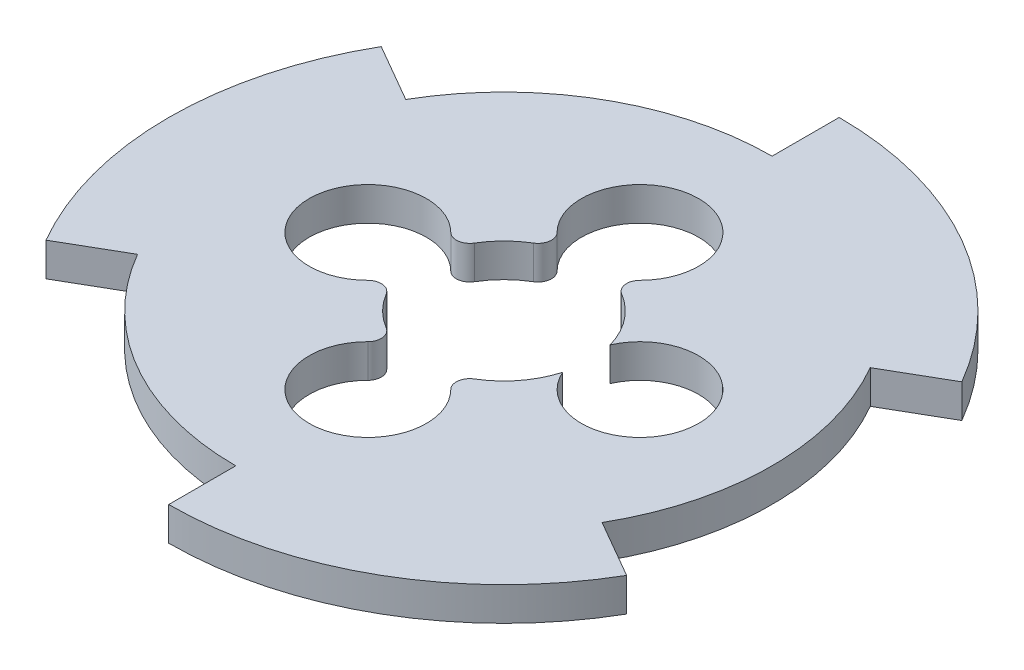
ISO-10303-21;
HEADER;
FILE_DESCRIPTION(('STEP AP214'),'2;1');
FILE_NAME('part.step','',(''),(''),'','','');
FILE_SCHEMA(('AUTOMOTIVE_DESIGN { 1 0 10303 214 1 1 1 1 }'));
ENDSEC;
DATA;
#1=APPLICATION_CONTEXT('core data for automotive mechanical design processes');
#2=APPLICATION_PROTOCOL_DEFINITION('international standard','automotive_design',2000,#1);
#3=PRODUCT_CONTEXT('',#1,'mechanical');
#4=PRODUCT('Part','Part','',(#3));
#5=PRODUCT_RELATED_PRODUCT_CATEGORY('part','',(#4));
#6=PRODUCT_DEFINITION_FORMATION('','',#4);
#7=PRODUCT_DEFINITION_CONTEXT('part definition',#1,'design');
#8=PRODUCT_DEFINITION('design','',#6,#7);
#9=PRODUCT_DEFINITION_SHAPE('','',#8);
#10=(LENGTH_UNIT() NAMED_UNIT(*) SI_UNIT(.MILLI.,.METRE.));
#11=(NAMED_UNIT(*) PLANE_ANGLE_UNIT() SI_UNIT($,.RADIAN.));
#12=(NAMED_UNIT(*) SI_UNIT($,.STERADIAN.) SOLID_ANGLE_UNIT());
#13=UNCERTAINTY_MEASURE_WITH_UNIT(LENGTH_MEASURE(1.E-05),#10,'distance_accuracy_value','');
#14=(GEOMETRIC_REPRESENTATION_CONTEXT(3) GLOBAL_UNCERTAINTY_ASSIGNED_CONTEXT((#13)) GLOBAL_UNIT_ASSIGNED_CONTEXT((#10,
#11,#12)) REPRESENTATION_CONTEXT('',''));
#15=CARTESIAN_POINT('',(0.,0.,0.));
#16=DIRECTION('',(0.,0.,1.));
#17=DIRECTION('',(1.,0.,0.));
#18=AXIS2_PLACEMENT_3D('',#15,#16,#17);
#19=CARTESIAN_POINT('',(0.,6.35,0.));
#20=DIRECTION('',(0.,1.,0.));
#21=DIRECTION('',(0.,0.,1.));
#22=AXIS2_PLACEMENT_3D('',#19,#20,#21);
#23=PLANE('',#22);
#24=CARTESIAN_POINT('',(0.,6.35,0.));
#25=DIRECTION('',(0.,1.,0.));
#26=DIRECTION('',(0.,0.,1.));
#27=AXIS2_PLACEMENT_3D('',#24,#25,#26);
#28=CIRCLE('',#27,50.8);
#29=CARTESIAN_POINT('',(43.9940905122495,6.35,25.4000000000001));
#30=VERTEX_POINT('',#29);
#31=CARTESIAN_POINT('',(43.9940905122495,6.35,-25.3999999999999));
#32=VERTEX_POINT('',#31);
#33=EDGE_CURVE('E271',#30,#32,#28,.T.);
#34=ORIENTED_EDGE('',*,*,#33,.T.);
#35=DIRECTION('',(0.86602540378444,0.,-0.499999999999998));
#36=VECTOR('',#35,1.);
#37=CARTESIAN_POINT('',(43.9940905122495,6.35,-25.3999999999999));
#38=LINE('',#37,#36);
#39=CARTESIAN_POINT('',(54.9926131403087,6.35,-31.749999999998));
#40=VERTEX_POINT('',#39);
#41=EDGE_CURVE('E274',#32,#40,#38,.T.);
#42=ORIENTED_EDGE('',*,*,#41,.T.);
#43=CARTESIAN_POINT('',(0.,6.35,0.));
#44=DIRECTION('',(0.,1.,0.));
#45=DIRECTION('',(0.,0.,1.));
#46=AXIS2_PLACEMENT_3D('',#43,#44,#45);
#47=CIRCLE('',#46,63.4999999999963);
#48=CARTESIAN_POINT('',(0.,6.35,-63.4999999999963));
#49=VERTEX_POINT('',#48);
#50=EDGE_CURVE('E277',#40,#49,#47,.T.);
#51=ORIENTED_EDGE('',*,*,#50,.T.);
#52=DIRECTION('',(0.,0.,1.));
#53=VECTOR('',#52,1.);
#54=CARTESIAN_POINT('',(0.,6.35,-50.8));
#55=LINE('',#54,#53);
#56=CARTESIAN_POINT('',(0.,6.35,-50.8));
#57=VERTEX_POINT('',#56);
#58=EDGE_CURVE('E279',#49,#57,#55,.T.);
#59=ORIENTED_EDGE('',*,*,#58,.T.);
#60=CARTESIAN_POINT('',(0.,6.35,0.));
#61=DIRECTION('',(0.,1.,0.));
#62=DIRECTION('',(0.,0.,1.));
#63=AXIS2_PLACEMENT_3D('',#60,#61,#62);
#64=CIRCLE('',#63,50.8);
#65=CARTESIAN_POINT('',(-43.9940905122495,6.35,-25.4000000000001));
#66=VERTEX_POINT('',#65);
#67=EDGE_CURVE('E281',#57,#66,#64,.T.);
#68=ORIENTED_EDGE('',*,*,#67,.T.);
#69=DIRECTION('',(-0.866025403784438,0.,-0.5));
#70=VECTOR('',#69,1.);
#71=CARTESIAN_POINT('',(-43.9940905122495,6.35,-25.4000000000001));
#72=LINE('',#71,#70);
#73=CARTESIAN_POINT('',(-54.9926131403086,6.35,-31.7499999999982));
#74=VERTEX_POINT('',#73);
#75=EDGE_CURVE('E283',#66,#74,#72,.T.);
#76=ORIENTED_EDGE('',*,*,#75,.T.);
#77=CARTESIAN_POINT('',(0.,6.35,0.));
#78=DIRECTION('',(0.,1.,0.));
#79=DIRECTION('',(0.,0.,1.));
#80=AXIS2_PLACEMENT_3D('',#77,#78,#79);
#81=CIRCLE('',#80,63.4999999999963);
#82=CARTESIAN_POINT('',(-54.9926131403086,6.35,31.7499999999982));
#83=VERTEX_POINT('',#82);
#84=EDGE_CURVE('E285',#74,#83,#81,.T.);
#85=ORIENTED_EDGE('',*,*,#84,.T.);
#86=DIRECTION('',(0.866025403784439,0.,-0.5));
#87=VECTOR('',#86,1.);
#88=CARTESIAN_POINT('',(-43.9940905122495,6.35,25.4000000000001));
#89=LINE('',#88,#87);
#90=CARTESIAN_POINT('',(-43.9940905122495,6.35,25.4000000000001));
#91=VERTEX_POINT('',#90);
#92=EDGE_CURVE('E287',#83,#91,#89,.T.);
#93=ORIENTED_EDGE('',*,*,#92,.T.);
#94=CARTESIAN_POINT('',(0.,6.35,0.));
#95=DIRECTION('',(0.,1.,0.));
#96=DIRECTION('',(0.,0.,1.));
#97=AXIS2_PLACEMENT_3D('',#94,#95,#96);
#98=CIRCLE('',#97,50.8000000000001);
#99=CARTESIAN_POINT('',(-1.50796394868042E-13,6.35,50.8000000000001));
#100=VERTEX_POINT('',#99);
#101=EDGE_CURVE('E289',#91,#100,#98,.T.);
#102=ORIENTED_EDGE('',*,*,#101,.T.);
#103=DIRECTION('',(0.,0.,1.));
#104=VECTOR('',#103,1.);
#105=CARTESIAN_POINT('',(-1.50796394868042E-13,6.35,50.8000000000001));
#106=LINE('',#105,#104);
#107=CARTESIAN_POINT('',(-1.12798659301909E-13,6.35,63.4999999999963));
#108=VERTEX_POINT('',#107);
#109=EDGE_CURVE('E291',#100,#108,#106,.T.);
#110=ORIENTED_EDGE('',*,*,#109,.T.);
#111=CARTESIAN_POINT('',(0.,6.35,0.));
#112=DIRECTION('',(0.,1.,0.));
#113=DIRECTION('',(0.,0.,1.));
#114=AXIS2_PLACEMENT_3D('',#111,#112,#113);
#115=CIRCLE('',#114,63.4999999999963);
#116=CARTESIAN_POINT('',(54.9926131403086,6.35,31.7499999999982));
#117=VERTEX_POINT('',#116);
#118=EDGE_CURVE('E293',#108,#117,#115,.T.);
#119=ORIENTED_EDGE('',*,*,#118,.T.);
#120=DIRECTION('',(-0.866025403784439,0.,-0.499999999999999));
#121=VECTOR('',#120,1.);
#122=CARTESIAN_POINT('',(43.9940905122495,6.35,25.4000000000001));
#123=LINE('',#122,#121);
#124=EDGE_CURVE('E295',#117,#30,#123,.T.);
#125=ORIENTED_EDGE('',*,*,#124,.T.);
#126=EDGE_LOOP('',(#34,#42,#51,#59,#68,#76,#85,#93,#102,#110,#119,#125));
#127=FACE_BOUND('',#126,.T.);
#128=CARTESIAN_POINT('',(0.,6.35,0.));
#129=DIRECTION('',(0.,1.,0.));
#130=DIRECTION('',(0.,0.,1.));
#131=AXIS2_PLACEMENT_3D('',#128,#129,#130);
#132=CIRCLE('',#131,16.256);
#133=CARTESIAN_POINT('',(-13.9479850885369,6.35,8.34932619855951));
#134=VERTEX_POINT('',#133);
#135=CARTESIAN_POINT('',(-8.34932619855964,6.35,13.9479850885368));
#136=VERTEX_POINT('',#135);
#137=EDGE_CURVE('E245',#134,#136,#132,.T.);
#138=ORIENTED_EDGE('',*,*,#137,.F.);
#139=CARTESIAN_POINT('',(-16.1273577586208,6.35,9.65390841708444));
#140=DIRECTION('',(0.,1.,0.));
#141=DIRECTION('',(0.,0.,1.));
#142=AXIS2_PLACEMENT_3D('',#139,#140,#141);
#143=CIRCLE('',#142,2.54);
#144=CARTESIAN_POINT('',(-17.9233842221332,6.35,7.85783243251054));
#145=VERTEX_POINT('',#144);
#146=EDGE_CURVE('E386',#134,#145,#143,.T.);
#147=ORIENTED_EDGE('',*,*,#146,.T.);
#148=CARTESIAN_POINT('',(-25.781,6.35,-2.70041641190144E-13));
#149=DIRECTION('',(0.,1.,0.));
#150=DIRECTION('',(0.,0.,1.));
#151=AXIS2_PLACEMENT_3D('',#148,#149,#150);
#152=CIRCLE('',#151,11.1125);
#153=CARTESIAN_POINT('',(-17.923384222133,6.35,-7.85783243251091));
#154=VERTEX_POINT('',#153);
#155=EDGE_CURVE('E242',#154,#145,#152,.T.);
#156=ORIENTED_EDGE('',*,*,#155,.F.);
#157=CARTESIAN_POINT('',(-16.1273577586206,6.35,-9.65390841708477));
#158=DIRECTION('',(0.,1.,0.));
#159=DIRECTION('',(0.,0.,1.));
#160=AXIS2_PLACEMENT_3D('',#157,#158,#159);
#161=CIRCLE('',#160,2.54);
#162=CARTESIAN_POINT('',(-13.9479850885367,6.35,-8.3493261985598));
#163=VERTEX_POINT('',#162);
#164=EDGE_CURVE('E48',#154,#163,#161,.T.);
#165=ORIENTED_EDGE('',*,*,#164,.T.);
#166=CARTESIAN_POINT('',(0.,6.35,0.));
#167=DIRECTION('',(0.,1.,0.));
#168=DIRECTION('',(0.,0.,1.));
#169=AXIS2_PLACEMENT_3D('',#166,#167,#168);
#170=CIRCLE('',#169,16.256);
#171=CARTESIAN_POINT('',(-8.34932619855966,6.35,-13.9479850885368));
#172=VERTEX_POINT('',#171);
#173=EDGE_CURVE('E236',#172,#163,#170,.T.);
#174=ORIENTED_EDGE('',*,*,#173,.F.);
#175=CARTESIAN_POINT('',(-9.65390841708461,6.35,-16.1273577586207));
#176=DIRECTION('',(0.,1.,0.));
#177=DIRECTION('',(0.,0.,1.));
#178=AXIS2_PLACEMENT_3D('',#175,#176,#177);
#179=CIRCLE('',#178,2.54);
#180=CARTESIAN_POINT('',(-7.85783243251072,6.35,-17.9233842221331));
#181=VERTEX_POINT('',#180);
#182=EDGE_CURVE('E379',#172,#181,#179,.T.);
#183=ORIENTED_EDGE('',*,*,#182,.T.);
#184=CARTESIAN_POINT('',(0.,6.35,-25.781));
#185=DIRECTION('',(0.,1.,0.));
#186=DIRECTION('',(0.,0.,1.));
#187=AXIS2_PLACEMENT_3D('',#184,#185,#186);
#188=CIRCLE('',#187,11.1125);
#189=CARTESIAN_POINT('',(7.85783243251073,6.35,-17.9233842221331));
#190=VERTEX_POINT('',#189);
#191=EDGE_CURVE('E232',#190,#181,#188,.T.);
#192=ORIENTED_EDGE('',*,*,#191,.F.);
#193=CARTESIAN_POINT('',(9.65390841708461,6.35,-16.1273577586207));
#194=DIRECTION('',(0.,1.,0.));
#195=DIRECTION('',(0.,0.,1.));
#196=AXIS2_PLACEMENT_3D('',#193,#194,#195);
#197=CIRCLE('',#196,2.54);
#198=CARTESIAN_POINT('',(8.34932619855966,6.35,-13.9479850885368));
#199=VERTEX_POINT('',#198);
#200=EDGE_CURVE('E231',#190,#199,#197,.T.);
#201=ORIENTED_EDGE('',*,*,#200,.T.);
#202=CARTESIAN_POINT('',(0.,6.35,0.));
#203=DIRECTION('',(0.,1.,0.));
#204=DIRECTION('',(0.,0.,1.));
#205=AXIS2_PLACEMENT_3D('',#202,#203,#204);
#206=CIRCLE('',#205,16.256);
#207=CARTESIAN_POINT('',(15.6206089901478,6.35,-4.50045672981381));
#208=VERTEX_POINT('',#207);
#209=EDGE_CURVE('E223',#208,#199,#206,.T.);
#210=ORIENTED_EDGE('',*,*,#209,.F.);
#211=CARTESIAN_POINT('',(25.781,6.35,0.));
#212=DIRECTION('',(0.,1.,0.));
#213=DIRECTION('',(0.,0.,1.));
#214=AXIS2_PLACEMENT_3D('',#211,#212,#213);
#215=CIRCLE('',#214,11.1125000000005);
#216=CARTESIAN_POINT('',(15.6206089901473,6.35,4.50045672981272));
#217=VERTEX_POINT('',#216);
#218=EDGE_CURVE('E207',#217,#208,#215,.T.);
#219=ORIENTED_EDGE('',*,*,#218,.F.);
#220=CARTESIAN_POINT('',(0.,6.35,0.));
#221=DIRECTION('',(0.,1.,0.));
#222=DIRECTION('',(0.,0.,1.));
#223=AXIS2_PLACEMENT_3D('',#220,#221,#222);
#224=CIRCLE('',#223,16.256);
#225=CARTESIAN_POINT('',(8.34932619855955,6.35,13.9479850885369));
#226=VERTEX_POINT('',#225);
#227=EDGE_CURVE('E217',#226,#217,#224,.T.);
#228=ORIENTED_EDGE('',*,*,#227,.F.);
#229=CARTESIAN_POINT('',(9.65390841708447,6.35,16.1273577586208));
#230=DIRECTION('',(0.,1.,0.));
#231=DIRECTION('',(0.,0.,1.));
#232=AXIS2_PLACEMENT_3D('',#229,#230,#231);
#233=CIRCLE('',#232,2.54);
#234=CARTESIAN_POINT('',(7.85783243251045,6.35,17.9233842221331));
#235=VERTEX_POINT('',#234);
#236=EDGE_CURVE('E382',#226,#235,#233,.T.);
#237=ORIENTED_EDGE('',*,*,#236,.T.);
#238=CARTESIAN_POINT('',(0.,6.35,25.7809999999984));
#239=DIRECTION('',(0.,1.,0.));
#240=DIRECTION('',(0.,0.,1.));
#241=AXIS2_PLACEMENT_3D('',#238,#239,#240);
#242=CIRCLE('',#241,11.1124999999988);
#243=CARTESIAN_POINT('',(-7.85783243251057,6.35,17.923384222133));
#244=VERTEX_POINT('',#243);
#245=EDGE_CURVE('E248',#244,#235,#242,.T.);
#246=ORIENTED_EDGE('',*,*,#245,.F.);
#247=CARTESIAN_POINT('',(-9.65390841708459,6.35,16.1273577586207));
#248=DIRECTION('',(0.,1.,0.));
#249=DIRECTION('',(0.,0.,1.));
#250=AXIS2_PLACEMENT_3D('',#247,#248,#249);
#251=CIRCLE('',#250,2.54);
#252=EDGE_CURVE('E384',#244,#136,#251,.T.);
#253=ORIENTED_EDGE('',*,*,#252,.T.);
#254=EDGE_LOOP('',(#138,#147,#156,#165,#174,#183,#192,#201,#210,#219,#228,#237,#246,#253));
#255=FACE_BOUND('',#254,.T.);
#256=ADVANCED_FACE('F33',(#127,#255),#23,.T.);
#257=CARTESIAN_POINT('',(0.,0.,0.));
#258=DIRECTION('',(0.,1.,0.));
#259=DIRECTION('',(0.,0.,1.));
#260=AXIS2_PLACEMENT_3D('',#257,#258,#259);
#261=PLANE('',#260);
#262=CARTESIAN_POINT('',(0.,0.,0.));
#263=DIRECTION('',(0.,1.,0.));
#264=DIRECTION('',(0.,0.,1.));
#265=AXIS2_PLACEMENT_3D('',#262,#263,#264);
#266=CIRCLE('',#265,50.8);
#267=CARTESIAN_POINT('',(43.9940905122495,0.,25.4000000000001));
#268=VERTEX_POINT('',#267);
#269=CARTESIAN_POINT('',(43.9940905122495,0.,-25.3999999999999));
#270=VERTEX_POINT('',#269);
#271=EDGE_CURVE('E270',#268,#270,#266,.T.);
#272=ORIENTED_EDGE('',*,*,#271,.F.);
#273=DIRECTION('',(-0.866025403784439,0.,-0.499999999999999));
#274=VECTOR('',#273,1.);
#275=CARTESIAN_POINT('',(43.9940905122495,0.,25.4000000000001));
#276=LINE('',#275,#274);
#277=CARTESIAN_POINT('',(54.9926131403086,0.,31.7499999999982));
#278=VERTEX_POINT('',#277);
#279=EDGE_CURVE('E275',#278,#268,#276,.T.);
#280=ORIENTED_EDGE('',*,*,#279,.F.);
#281=CARTESIAN_POINT('',(0.,0.,0.));
#282=DIRECTION('',(0.,1.,0.));
#283=DIRECTION('',(0.,0.,1.));
#284=AXIS2_PLACEMENT_3D('',#281,#282,#283);
#285=CIRCLE('',#284,63.4999999999963);
#286=CARTESIAN_POINT('',(-1.12798659301909E-13,0.,63.4999999999963));
#287=VERTEX_POINT('',#286);
#288=EDGE_CURVE('E318',#287,#278,#285,.T.);
#289=ORIENTED_EDGE('',*,*,#288,.F.);
#290=DIRECTION('',(0.,0.,1.));
#291=VECTOR('',#290,1.);
#292=CARTESIAN_POINT('',(-1.50796394868042E-13,0.,50.8000000000001));
#293=LINE('',#292,#291);
#294=CARTESIAN_POINT('',(-1.50796394868042E-13,0.,50.8000000000001));
#295=VERTEX_POINT('',#294);
#296=EDGE_CURVE('E316',#295,#287,#293,.T.);
#297=ORIENTED_EDGE('',*,*,#296,.F.);
#298=CARTESIAN_POINT('',(0.,0.,0.));
#299=DIRECTION('',(0.,1.,0.));
#300=DIRECTION('',(0.,0.,1.));
#301=AXIS2_PLACEMENT_3D('',#298,#299,#300);
#302=CIRCLE('',#301,50.8000000000001);
#303=CARTESIAN_POINT('',(-43.9940905122495,0.,25.4000000000001));
#304=VERTEX_POINT('',#303);
#305=EDGE_CURVE('E314',#304,#295,#302,.T.);
#306=ORIENTED_EDGE('',*,*,#305,.F.);
#307=DIRECTION('',(0.866025403784439,0.,-0.5));
#308=VECTOR('',#307,1.);
#309=CARTESIAN_POINT('',(-43.9940905122495,0.,25.4000000000001));
#310=LINE('',#309,#308);
#311=CARTESIAN_POINT('',(-54.9926131403086,0.,31.7499999999982));
#312=VERTEX_POINT('',#311);
#313=EDGE_CURVE('E312',#312,#304,#310,.T.);
#314=ORIENTED_EDGE('',*,*,#313,.F.);
#315=CARTESIAN_POINT('',(0.,0.,0.));
#316=DIRECTION('',(0.,1.,0.));
#317=DIRECTION('',(0.,0.,1.));
#318=AXIS2_PLACEMENT_3D('',#315,#316,#317);
#319=CIRCLE('',#318,63.4999999999963);
#320=CARTESIAN_POINT('',(-54.9926131403086,0.,-31.7499999999982));
#321=VERTEX_POINT('',#320);
#322=EDGE_CURVE('E310',#321,#312,#319,.T.);
#323=ORIENTED_EDGE('',*,*,#322,.F.);
#324=DIRECTION('',(-0.866025403784438,0.,-0.5));
#325=VECTOR('',#324,1.);
#326=CARTESIAN_POINT('',(-43.9940905122495,0.,-25.4000000000001));
#327=LINE('',#326,#325);
#328=CARTESIAN_POINT('',(-43.9940905122495,0.,-25.4000000000001));
#329=VERTEX_POINT('',#328);
#330=EDGE_CURVE('E308',#329,#321,#327,.T.);
#331=ORIENTED_EDGE('',*,*,#330,.F.);
#332=CARTESIAN_POINT('',(0.,0.,0.));
#333=DIRECTION('',(0.,1.,0.));
#334=DIRECTION('',(0.,0.,1.));
#335=AXIS2_PLACEMENT_3D('',#332,#333,#334);
#336=CIRCLE('',#335,50.8);
#337=CARTESIAN_POINT('',(0.,0.,-50.8));
#338=VERTEX_POINT('',#337);
#339=EDGE_CURVE('E306',#338,#329,#336,.T.);
#340=ORIENTED_EDGE('',*,*,#339,.F.);
#341=DIRECTION('',(0.,0.,1.));
#342=VECTOR('',#341,1.);
#343=CARTESIAN_POINT('',(0.,0.,-50.8));
#344=LINE('',#343,#342);
#345=CARTESIAN_POINT('',(0.,0.,-63.4999999999963));
#346=VERTEX_POINT('',#345);
#347=EDGE_CURVE('E304',#346,#338,#344,.T.);
#348=ORIENTED_EDGE('',*,*,#347,.F.);
#349=CARTESIAN_POINT('',(0.,0.,0.));
#350=DIRECTION('',(0.,1.,0.));
#351=DIRECTION('',(0.,0.,1.));
#352=AXIS2_PLACEMENT_3D('',#349,#350,#351);
#353=CIRCLE('',#352,63.4999999999963);
#354=CARTESIAN_POINT('',(54.9926131403087,0.,-31.749999999998));
#355=VERTEX_POINT('',#354);
#356=EDGE_CURVE('E302',#355,#346,#353,.T.);
#357=ORIENTED_EDGE('',*,*,#356,.F.);
#358=DIRECTION('',(0.86602540378444,0.,-0.499999999999998));
#359=VECTOR('',#358,1.);
#360=CARTESIAN_POINT('',(43.9940905122495,0.,-25.3999999999999));
#361=LINE('',#360,#359);
#362=EDGE_CURVE('E300',#270,#355,#361,.T.);
#363=ORIENTED_EDGE('',*,*,#362,.F.);
#364=EDGE_LOOP('',(#272,#280,#289,#297,#306,#314,#323,#331,#340,#348,#357,#363));
#365=FACE_BOUND('',#364,.T.);
#366=CARTESIAN_POINT('',(-25.781,0.,-2.70041641190144E-13));
#367=DIRECTION('',(0.,1.,0.));
#368=DIRECTION('',(0.,0.,1.));
#369=AXIS2_PLACEMENT_3D('',#366,#367,#368);
#370=CIRCLE('',#369,11.1125);
#371=CARTESIAN_POINT('',(-17.923384222133,0.,-7.85783243251091));
#372=VERTEX_POINT('',#371);
#373=CARTESIAN_POINT('',(-17.9233842221332,0.,7.85783243251054));
#374=VERTEX_POINT('',#373);
#375=EDGE_CURVE('E259',#372,#374,#370,.T.);
#376=ORIENTED_EDGE('',*,*,#375,.T.);
#377=CARTESIAN_POINT('',(-16.1273577586208,0.,9.65390841708444));
#378=DIRECTION('',(0.,1.,0.));
#379=DIRECTION('',(0.,0.,1.));
#380=AXIS2_PLACEMENT_3D('',#377,#378,#379);
#381=CIRCLE('',#380,2.54);
#382=CARTESIAN_POINT('',(-13.9479850885369,0.,8.34932619855951));
#383=VERTEX_POINT('',#382);
#384=EDGE_CURVE('E371',#374,#383,#381,.F.);
#385=ORIENTED_EDGE('',*,*,#384,.T.);
#386=CARTESIAN_POINT('',(0.,0.,0.));
#387=DIRECTION('',(0.,1.,0.));
#388=DIRECTION('',(0.,0.,1.));
#389=AXIS2_PLACEMENT_3D('',#386,#387,#388);
#390=CIRCLE('',#389,16.256);
#391=CARTESIAN_POINT('',(-8.34932619855964,0.,13.9479850885368));
#392=VERTEX_POINT('',#391);
#393=EDGE_CURVE('E262',#383,#392,#390,.T.);
#394=ORIENTED_EDGE('',*,*,#393,.T.);
#395=CARTESIAN_POINT('',(-9.65390841708459,0.,16.1273577586207));
#396=DIRECTION('',(0.,1.,0.));
#397=DIRECTION('',(0.,0.,1.));
#398=AXIS2_PLACEMENT_3D('',#395,#396,#397);
#399=CIRCLE('',#398,2.54);
#400=CARTESIAN_POINT('',(-7.85783243251057,0.,17.923384222133));
#401=VERTEX_POINT('',#400);
#402=EDGE_CURVE('E369',#392,#401,#399,.F.);
#403=ORIENTED_EDGE('',*,*,#402,.T.);
#404=CARTESIAN_POINT('',(0.,0.,25.7809999999984));
#405=DIRECTION('',(0.,1.,0.));
#406=DIRECTION('',(0.,0.,1.));
#407=AXIS2_PLACEMENT_3D('',#404,#405,#406);
#408=CIRCLE('',#407,11.1124999999988);
#409=CARTESIAN_POINT('',(7.85783243251045,0.,17.9233842221331));
#410=VERTEX_POINT('',#409);
#411=EDGE_CURVE('E265',#401,#410,#408,.T.);
#412=ORIENTED_EDGE('',*,*,#411,.T.);
#413=CARTESIAN_POINT('',(9.65390841708447,0.,16.1273577586208));
#414=DIRECTION('',(0.,1.,0.));
#415=DIRECTION('',(0.,0.,1.));
#416=AXIS2_PLACEMENT_3D('',#413,#414,#415);
#417=CIRCLE('',#416,2.54);
#418=CARTESIAN_POINT('',(8.34932619855955,0.,13.9479850885369));
#419=VERTEX_POINT('',#418);
#420=EDGE_CURVE('E367',#410,#419,#417,.F.);
#421=ORIENTED_EDGE('',*,*,#420,.T.);
#422=CARTESIAN_POINT('',(0.,0.,0.));
#423=DIRECTION('',(0.,1.,0.));
#424=DIRECTION('',(0.,0.,1.));
#425=AXIS2_PLACEMENT_3D('',#422,#423,#424);
#426=CIRCLE('',#425,16.256);
#427=CARTESIAN_POINT('',(15.6206089901473,0.,4.50045672981272));
#428=VERTEX_POINT('',#427);
#429=EDGE_CURVE('E238',#419,#428,#426,.T.);
#430=ORIENTED_EDGE('',*,*,#429,.T.);
#431=CARTESIAN_POINT('',(25.781,0.,0.));
#432=DIRECTION('',(0.,1.,0.));
#433=DIRECTION('',(0.,0.,1.));
#434=AXIS2_PLACEMENT_3D('',#431,#432,#433);
#435=CIRCLE('',#434,11.1125000000005);
#436=CARTESIAN_POINT('',(15.6206089901478,0.,-4.50045672981381));
#437=VERTEX_POINT('',#436);
#438=EDGE_CURVE('E233',#428,#437,#435,.T.);
#439=ORIENTED_EDGE('',*,*,#438,.T.);
#440=CARTESIAN_POINT('',(0.,0.,0.));
#441=DIRECTION('',(0.,1.,0.));
#442=DIRECTION('',(0.,0.,1.));
#443=AXIS2_PLACEMENT_3D('',#440,#441,#442);
#444=CIRCLE('',#443,16.256);
#445=CARTESIAN_POINT('',(8.34932619855966,0.,-13.9479850885368));
#446=VERTEX_POINT('',#445);
#447=EDGE_CURVE('E226',#437,#446,#444,.T.);
#448=ORIENTED_EDGE('',*,*,#447,.T.);
#449=CARTESIAN_POINT('',(9.65390841708461,0.,-16.1273577586207));
#450=DIRECTION('',(0.,1.,0.));
#451=DIRECTION('',(0.,0.,1.));
#452=AXIS2_PLACEMENT_3D('',#449,#450,#451);
#453=CIRCLE('',#452,2.54);
#454=CARTESIAN_POINT('',(7.85783243251073,0.,-17.9233842221331));
#455=VERTEX_POINT('',#454);
#456=EDGE_CURVE('E365',#446,#455,#453,.F.);
#457=ORIENTED_EDGE('',*,*,#456,.T.);
#458=CARTESIAN_POINT('',(0.,0.,-25.781));
#459=DIRECTION('',(0.,1.,0.));
#460=DIRECTION('',(0.,0.,1.));
#461=AXIS2_PLACEMENT_3D('',#458,#459,#460);
#462=CIRCLE('',#461,11.1125);
#463=CARTESIAN_POINT('',(-7.85783243251072,0.,-17.9233842221331));
#464=VERTEX_POINT('',#463);
#465=EDGE_CURVE('E253',#455,#464,#462,.T.);
#466=ORIENTED_EDGE('',*,*,#465,.T.);
#467=CARTESIAN_POINT('',(-9.65390841708461,0.,-16.1273577586207));
#468=DIRECTION('',(0.,1.,0.));
#469=DIRECTION('',(0.,0.,1.));
#470=AXIS2_PLACEMENT_3D('',#467,#468,#469);
#471=CIRCLE('',#470,2.54);
#472=CARTESIAN_POINT('',(-8.34932619855966,0.,-13.9479850885368));
#473=VERTEX_POINT('',#472);
#474=EDGE_CURVE('E363',#464,#473,#471,.F.);
#475=ORIENTED_EDGE('',*,*,#474,.T.);
#476=CARTESIAN_POINT('',(0.,0.,0.));
#477=DIRECTION('',(0.,1.,0.));
#478=DIRECTION('',(0.,0.,1.));
#479=AXIS2_PLACEMENT_3D('',#476,#477,#478);
#480=CIRCLE('',#479,16.256);
#481=CARTESIAN_POINT('',(-13.9479850885367,0.,-8.3493261985598));
#482=VERTEX_POINT('',#481);
#483=EDGE_CURVE('E256',#473,#482,#480,.T.);
#484=ORIENTED_EDGE('',*,*,#483,.T.);
#485=CARTESIAN_POINT('',(-16.1273577586206,0.,-9.65390841708477));
#486=DIRECTION('',(0.,1.,0.));
#487=DIRECTION('',(0.,0.,1.));
#488=AXIS2_PLACEMENT_3D('',#485,#486,#487);
#489=CIRCLE('',#488,2.54);
#490=EDGE_CURVE('E361',#482,#372,#489,.F.);
#491=ORIENTED_EDGE('',*,*,#490,.T.);
#492=EDGE_LOOP('',(#376,#385,#394,#403,#412,#421,#430,#439,#448,#457,#466,#475,#484,#491));
#493=FACE_BOUND('',#492,.T.);
#494=ADVANCED_FACE('F406',(#365,#493),#261,.F.);
#495=CARTESIAN_POINT('',(0.,6.35,0.));
#496=DIRECTION('',(0.,-1.,0.));
#497=DIRECTION('',(0.,0.,-1.));
#498=AXIS2_PLACEMENT_3D('',#495,#496,#497);
#499=CYLINDRICAL_SURFACE('',#498,50.8);
#500=ORIENTED_EDGE('',*,*,#271,.T.);
#501=DIRECTION('',(0.,-1.,0.));
#502=VECTOR('',#501,1.);
#503=CARTESIAN_POINT('',(43.9940905122495,6.35,-25.3999999999999));
#504=LINE('',#503,#502);
#505=EDGE_CURVE('E353',#32,#270,#504,.T.);
#506=ORIENTED_EDGE('',*,*,#505,.F.);
#507=ORIENTED_EDGE('',*,*,#33,.F.);
#508=DIRECTION('',(0.,-1.,0.));
#509=VECTOR('',#508,1.);
#510=CARTESIAN_POINT('',(43.9940905122495,6.35,25.4000000000001));
#511=LINE('',#510,#509);
#512=EDGE_CURVE('E297',#30,#268,#511,.T.);
#513=ORIENTED_EDGE('',*,*,#512,.T.);
#514=EDGE_LOOP('',(#500,#506,#507,#513));
#515=FACE_BOUND('',#514,.T.);
#516=ADVANCED_FACE('F456',(#515),#499,.T.);
#517=CARTESIAN_POINT('',(43.9940905122495,6.35,-25.3999999999999));
#518=DIRECTION('',(-0.499999999999998,0.,-0.86602540378444));
#519=DIRECTION('',(-0.86602540378444,0.,0.499999999999998));
#520=AXIS2_PLACEMENT_3D('',#517,#518,#519);
#521=PLANE('',#520);
#522=ORIENTED_EDGE('',*,*,#362,.T.);
#523=DIRECTION('',(0.,-1.,0.));
#524=VECTOR('',#523,1.);
#525=CARTESIAN_POINT('',(54.9926131403087,6.35,-31.749999999998));
#526=LINE('',#525,#524);
#527=EDGE_CURVE('E350',#40,#355,#526,.T.);
#528=ORIENTED_EDGE('',*,*,#527,.F.);
#529=ORIENTED_EDGE('',*,*,#41,.F.);
#530=ORIENTED_EDGE('',*,*,#505,.T.);
#531=EDGE_LOOP('',(#522,#528,#529,#530));
#532=FACE_BOUND('',#531,.T.);
#533=ADVANCED_FACE('F501',(#532),#521,.F.);
#534=CARTESIAN_POINT('',(0.,6.35,0.));
#535=DIRECTION('',(0.,-1.,0.));
#536=DIRECTION('',(0.,0.,-1.));
#537=AXIS2_PLACEMENT_3D('',#534,#535,#536);
#538=CYLINDRICAL_SURFACE('',#537,63.4999999999963);
#539=ORIENTED_EDGE('',*,*,#356,.T.);
#540=DIRECTION('',(0.,-1.,0.));
#541=VECTOR('',#540,1.);
#542=CARTESIAN_POINT('',(0.,6.35,-63.4999999999963));
#543=LINE('',#542,#541);
#544=EDGE_CURVE('E347',#49,#346,#543,.T.);
#545=ORIENTED_EDGE('',*,*,#544,.F.);
#546=ORIENTED_EDGE('',*,*,#50,.F.);
#547=ORIENTED_EDGE('',*,*,#527,.T.);
#548=EDGE_LOOP('',(#539,#545,#546,#547));
#549=FACE_BOUND('',#548,.T.);
#550=ADVANCED_FACE('F497',(#549),#538,.T.);
#551=CARTESIAN_POINT('',(0.,6.35,-50.8));
#552=DIRECTION('',(1.,0.,0.));
#553=DIRECTION('',(0.,0.,-1.));
#554=AXIS2_PLACEMENT_3D('',#551,#552,#553);
#555=PLANE('',#554);
#556=ORIENTED_EDGE('',*,*,#347,.T.);
#557=DIRECTION('',(0.,-1.,0.));
#558=VECTOR('',#557,1.);
#559=CARTESIAN_POINT('',(0.,6.35,-50.8));
#560=LINE('',#559,#558);
#561=EDGE_CURVE('E344',#57,#338,#560,.T.);
#562=ORIENTED_EDGE('',*,*,#561,.F.);
#563=ORIENTED_EDGE('',*,*,#58,.F.);
#564=ORIENTED_EDGE('',*,*,#544,.T.);
#565=EDGE_LOOP('',(#556,#562,#563,#564));
#566=FACE_BOUND('',#565,.T.);
#567=ADVANCED_FACE('F493',(#566),#555,.F.);
#568=CARTESIAN_POINT('',(0.,6.35,0.));
#569=DIRECTION('',(0.,-1.,0.));
#570=DIRECTION('',(0.,0.,-1.));
#571=AXIS2_PLACEMENT_3D('',#568,#569,#570);
#572=CYLINDRICAL_SURFACE('',#571,50.8);
#573=ORIENTED_EDGE('',*,*,#339,.T.);
#574=DIRECTION('',(0.,-1.,0.));
#575=VECTOR('',#574,1.);
#576=CARTESIAN_POINT('',(-43.9940905122495,6.35,-25.4000000000001));
#577=LINE('',#576,#575);
#578=EDGE_CURVE('E341',#66,#329,#577,.T.);
#579=ORIENTED_EDGE('',*,*,#578,.F.);
#580=ORIENTED_EDGE('',*,*,#67,.F.);
#581=ORIENTED_EDGE('',*,*,#561,.T.);
#582=EDGE_LOOP('',(#573,#579,#580,#581));
#583=FACE_BOUND('',#582,.T.);
#584=ADVANCED_FACE('F489',(#583),#572,.T.);
#585=CARTESIAN_POINT('',(-43.9940905122495,6.35,-25.4000000000001));
#586=DIRECTION('',(-0.5,0.,0.866025403784439));
#587=DIRECTION('',(0.866025403784439,0.,0.5));
#588=AXIS2_PLACEMENT_3D('',#585,#586,#587);
#589=PLANE('',#588);
#590=ORIENTED_EDGE('',*,*,#330,.T.);
#591=DIRECTION('',(0.,-1.,0.));
#592=VECTOR('',#591,1.);
#593=CARTESIAN_POINT('',(-54.9926131403086,6.35,-31.7499999999982));
#594=LINE('',#593,#592);
#595=EDGE_CURVE('E338',#74,#321,#594,.T.);
#596=ORIENTED_EDGE('',*,*,#595,.F.);
#597=ORIENTED_EDGE('',*,*,#75,.F.);
#598=ORIENTED_EDGE('',*,*,#578,.T.);
#599=EDGE_LOOP('',(#590,#596,#597,#598));
#600=FACE_BOUND('',#599,.T.);
#601=ADVANCED_FACE('F485',(#600),#589,.F.);
#602=CARTESIAN_POINT('',(0.,6.35,0.));
#603=DIRECTION('',(0.,-1.,0.));
#604=DIRECTION('',(0.,0.,-1.));
#605=AXIS2_PLACEMENT_3D('',#602,#603,#604);
#606=CYLINDRICAL_SURFACE('',#605,63.4999999999963);
#607=ORIENTED_EDGE('',*,*,#322,.T.);
#608=DIRECTION('',(0.,-1.,0.));
#609=VECTOR('',#608,1.);
#610=CARTESIAN_POINT('',(-54.9926131403086,6.35,31.7499999999982));
#611=LINE('',#610,#609);
#612=EDGE_CURVE('E335',#83,#312,#611,.T.);
#613=ORIENTED_EDGE('',*,*,#612,.F.);
#614=ORIENTED_EDGE('',*,*,#84,.F.);
#615=ORIENTED_EDGE('',*,*,#595,.T.);
#616=EDGE_LOOP('',(#607,#613,#614,#615));
#617=FACE_BOUND('',#616,.T.);
#618=ADVANCED_FACE('F481',(#617),#606,.T.);
#619=CARTESIAN_POINT('',(-43.9940905122495,6.35,25.4000000000001));
#620=DIRECTION('',(-0.5,0.,-0.866025403784439));
#621=DIRECTION('',(-0.866025403784439,0.,0.5));
#622=AXIS2_PLACEMENT_3D('',#619,#620,#621);
#623=PLANE('',#622);
#624=ORIENTED_EDGE('',*,*,#313,.T.);
#625=DIRECTION('',(0.,-1.,0.));
#626=VECTOR('',#625,1.);
#627=CARTESIAN_POINT('',(-43.9940905122495,6.35,25.4000000000001));
#628=LINE('',#627,#626);
#629=EDGE_CURVE('E332',#91,#304,#628,.T.);
#630=ORIENTED_EDGE('',*,*,#629,.F.);
#631=ORIENTED_EDGE('',*,*,#92,.F.);
#632=ORIENTED_EDGE('',*,*,#612,.T.);
#633=EDGE_LOOP('',(#624,#630,#631,#632));
#634=FACE_BOUND('',#633,.T.);
#635=ADVANCED_FACE('F477',(#634),#623,.F.);
#636=CARTESIAN_POINT('',(0.,6.35,0.));
#637=DIRECTION('',(0.,-1.,0.));
#638=DIRECTION('',(0.,0.,-1.));
#639=AXIS2_PLACEMENT_3D('',#636,#637,#638);
#640=CYLINDRICAL_SURFACE('',#639,50.8000000000001);
#641=ORIENTED_EDGE('',*,*,#305,.T.);
#642=DIRECTION('',(0.,-1.,0.));
#643=VECTOR('',#642,1.);
#644=CARTESIAN_POINT('',(-1.50796394868042E-13,6.35,50.8000000000001));
#645=LINE('',#644,#643);
#646=EDGE_CURVE('E329',#100,#295,#645,.T.);
#647=ORIENTED_EDGE('',*,*,#646,.F.);
#648=ORIENTED_EDGE('',*,*,#101,.F.);
#649=ORIENTED_EDGE('',*,*,#629,.T.);
#650=EDGE_LOOP('',(#641,#647,#648,#649));
#651=FACE_BOUND('',#650,.T.);
#652=ADVANCED_FACE('F473',(#651),#640,.T.);
#653=CARTESIAN_POINT('',(-1.50796394868042E-13,6.35,50.8000000000001));
#654=DIRECTION('',(1.,0.,0.));
#655=DIRECTION('',(0.,0.,-1.));
#656=AXIS2_PLACEMENT_3D('',#653,#654,#655);
#657=PLANE('',#656);
#658=ORIENTED_EDGE('',*,*,#296,.T.);
#659=DIRECTION('',(0.,-1.,0.));
#660=VECTOR('',#659,1.);
#661=CARTESIAN_POINT('',(-1.12798659301909E-13,6.35,63.4999999999963));
#662=LINE('',#661,#660);
#663=EDGE_CURVE('E326',#108,#287,#662,.T.);
#664=ORIENTED_EDGE('',*,*,#663,.F.);
#665=ORIENTED_EDGE('',*,*,#109,.F.);
#666=ORIENTED_EDGE('',*,*,#646,.T.);
#667=EDGE_LOOP('',(#658,#664,#665,#666));
#668=FACE_BOUND('',#667,.T.);
#669=ADVANCED_FACE('F469',(#668),#657,.F.);
#670=CARTESIAN_POINT('',(0.,6.35,0.));
#671=DIRECTION('',(0.,-1.,0.));
#672=DIRECTION('',(0.,0.,-1.));
#673=AXIS2_PLACEMENT_3D('',#670,#671,#672);
#674=CYLINDRICAL_SURFACE('',#673,63.4999999999963);
#675=ORIENTED_EDGE('',*,*,#288,.T.);
#676=DIRECTION('',(0.,-1.,0.));
#677=VECTOR('',#676,1.);
#678=CARTESIAN_POINT('',(54.9926131403086,6.35,31.7499999999982));
#679=LINE('',#678,#677);
#680=EDGE_CURVE('E323',#117,#278,#679,.T.);
#681=ORIENTED_EDGE('',*,*,#680,.F.);
#682=ORIENTED_EDGE('',*,*,#118,.F.);
#683=ORIENTED_EDGE('',*,*,#663,.T.);
#684=EDGE_LOOP('',(#675,#681,#682,#683));
#685=FACE_BOUND('',#684,.T.);
#686=ADVANCED_FACE('F465',(#685),#674,.T.);
#687=CARTESIAN_POINT('',(43.9940905122495,6.35,25.4000000000001));
#688=DIRECTION('',(-0.499999999999999,0.,0.866025403784439));
#689=DIRECTION('',(0.866025403784439,0.,0.499999999999999));
#690=AXIS2_PLACEMENT_3D('',#687,#688,#689);
#691=PLANE('',#690);
#692=ORIENTED_EDGE('',*,*,#279,.T.);
#693=ORIENTED_EDGE('',*,*,#512,.F.);
#694=ORIENTED_EDGE('',*,*,#124,.F.);
#695=ORIENTED_EDGE('',*,*,#680,.T.);
#696=EDGE_LOOP('',(#692,#693,#694,#695));
#697=FACE_BOUND('',#696,.T.);
#698=ADVANCED_FACE('F462',(#697),#691,.F.);
#699=CARTESIAN_POINT('',(0.,6.35,0.));
#700=DIRECTION('',(0.,-1.,0.));
#701=DIRECTION('',(0.,0.,-1.));
#702=AXIS2_PLACEMENT_3D('',#699,#700,#701);
#703=CYLINDRICAL_SURFACE('',#702,16.256);
#704=ORIENTED_EDGE('',*,*,#209,.T.);
#705=DIRECTION('',(0.,-1.,0.));
#706=VECTOR('',#705,1.);
#707=CARTESIAN_POINT('',(8.34932619855966,6.35,-13.9479850885368));
#708=LINE('',#707,#706);
#709=EDGE_CURVE('E395',#199,#446,#708,.T.);
#710=ORIENTED_EDGE('',*,*,#709,.T.);
#711=ORIENTED_EDGE('',*,*,#447,.F.);
#712=DIRECTION('',(0.,-1.,0.));
#713=VECTOR('',#712,1.);
#714=CARTESIAN_POINT('',(15.6206089901478,6.35,-4.50045672981381));
#715=LINE('',#714,#713);
#716=EDGE_CURVE('E211',#208,#437,#715,.T.);
#717=ORIENTED_EDGE('',*,*,#716,.F.);
#718=EDGE_LOOP('',(#704,#710,#711,#717));
#719=FACE_BOUND('',#718,.T.);
#720=ADVANCED_FACE('F221',(#719),#703,.F.);
#721=CARTESIAN_POINT('',(0.,6.35,-25.781));
#722=DIRECTION('',(0.,-1.,0.));
#723=DIRECTION('',(0.,0.,-1.));
#724=AXIS2_PLACEMENT_3D('',#721,#722,#723);
#725=CYLINDRICAL_SURFACE('',#724,11.1125);
#726=ORIENTED_EDGE('',*,*,#465,.F.);
#727=DIRECTION('',(0.,-1.,0.));
#728=VECTOR('',#727,1.);
#729=CARTESIAN_POINT('',(7.85783243251073,6.35,-17.9233842221331));
#730=LINE('',#729,#728);
#731=EDGE_CURVE('E400',#455,#190,#730,.F.);
#732=ORIENTED_EDGE('',*,*,#731,.T.);
#733=ORIENTED_EDGE('',*,*,#191,.T.);
#734=DIRECTION('',(0.,-1.,0.));
#735=VECTOR('',#734,1.);
#736=CARTESIAN_POINT('',(-7.85783243251072,6.35,-17.9233842221331));
#737=LINE('',#736,#735);
#738=EDGE_CURVE('E397',#181,#464,#737,.T.);
#739=ORIENTED_EDGE('',*,*,#738,.T.);
#740=EDGE_LOOP('',(#726,#732,#733,#739));
#741=FACE_BOUND('',#740,.T.);
#742=ADVANCED_FACE('F414',(#741),#725,.F.);
#743=CARTESIAN_POINT('',(0.,6.35,0.));
#744=DIRECTION('',(0.,-1.,0.));
#745=DIRECTION('',(0.,0.,-1.));
#746=AXIS2_PLACEMENT_3D('',#743,#744,#745);
#747=CYLINDRICAL_SURFACE('',#746,16.256);
#748=ORIENTED_EDGE('',*,*,#483,.F.);
#749=DIRECTION('',(0.,-1.,0.));
#750=VECTOR('',#749,1.);
#751=CARTESIAN_POINT('',(-8.34932619855966,6.35,-13.9479850885368));
#752=LINE('',#751,#750);
#753=EDGE_CURVE('E11',#473,#172,#752,.F.);
#754=ORIENTED_EDGE('',*,*,#753,.T.);
#755=ORIENTED_EDGE('',*,*,#173,.T.);
#756=DIRECTION('',(0.,-1.,0.));
#757=VECTOR('',#756,1.);
#758=CARTESIAN_POINT('',(-13.9479850885367,6.35,-8.3493261985598));
#759=LINE('',#758,#757);
#760=EDGE_CURVE('E41',#163,#482,#759,.T.);
#761=ORIENTED_EDGE('',*,*,#760,.T.);
#762=EDGE_LOOP('',(#748,#754,#755,#761));
#763=FACE_BOUND('',#762,.T.);
#764=ADVANCED_FACE('F403',(#763),#747,.F.);
#765=CARTESIAN_POINT('',(-25.781,6.35,-2.70041641190144E-13));
#766=DIRECTION('',(0.,-1.,0.));
#767=DIRECTION('',(0.,0.,-1.));
#768=AXIS2_PLACEMENT_3D('',#765,#766,#767);
#769=CYLINDRICAL_SURFACE('',#768,11.1125);
#770=ORIENTED_EDGE('',*,*,#155,.T.);
#771=DIRECTION('',(0.,-1.,0.));
#772=VECTOR('',#771,1.);
#773=CARTESIAN_POINT('',(-17.9233842221332,6.35,7.85783243251054));
#774=LINE('',#773,#772);
#775=EDGE_CURVE('E358',#145,#374,#774,.T.);
#776=ORIENTED_EDGE('',*,*,#775,.T.);
#777=ORIENTED_EDGE('',*,*,#375,.F.);
#778=DIRECTION('',(0.,-1.,0.));
#779=VECTOR('',#778,1.);
#780=CARTESIAN_POINT('',(-17.923384222133,6.35,-7.85783243251091));
#781=LINE('',#780,#779);
#782=EDGE_CURVE('E356',#372,#154,#781,.F.);
#783=ORIENTED_EDGE('',*,*,#782,.T.);
#784=EDGE_LOOP('',(#770,#776,#777,#783));
#785=FACE_BOUND('',#784,.T.);
#786=ADVANCED_FACE('F444',(#785),#769,.F.);
#787=CARTESIAN_POINT('',(0.,6.35,0.));
#788=DIRECTION('',(0.,-1.,0.));
#789=DIRECTION('',(0.,0.,-1.));
#790=AXIS2_PLACEMENT_3D('',#787,#788,#789);
#791=CYLINDRICAL_SURFACE('',#790,16.256);
#792=ORIENTED_EDGE('',*,*,#393,.F.);
#793=DIRECTION('',(0.,-1.,0.));
#794=VECTOR('',#793,1.);
#795=CARTESIAN_POINT('',(-13.9479850885369,6.35,8.34932619855951));
#796=LINE('',#795,#794);
#797=EDGE_CURVE('E376',#383,#134,#796,.F.);
#798=ORIENTED_EDGE('',*,*,#797,.T.);
#799=ORIENTED_EDGE('',*,*,#137,.T.);
#800=DIRECTION('',(0.,-1.,0.));
#801=VECTOR('',#800,1.);
#802=CARTESIAN_POINT('',(-8.34932619855964,6.35,13.9479850885368));
#803=LINE('',#802,#801);
#804=EDGE_CURVE('E373',#136,#392,#803,.T.);
#805=ORIENTED_EDGE('',*,*,#804,.T.);
#806=EDGE_LOOP('',(#792,#798,#799,#805));
#807=FACE_BOUND('',#806,.T.);
#808=ADVANCED_FACE('F437',(#807),#791,.F.);
#809=CARTESIAN_POINT('',(0.,6.35,25.7809999999984));
#810=DIRECTION('',(0.,-1.,0.));
#811=DIRECTION('',(0.,0.,-1.));
#812=AXIS2_PLACEMENT_3D('',#809,#810,#811);
#813=CYLINDRICAL_SURFACE('',#812,11.1124999999988);
#814=ORIENTED_EDGE('',*,*,#411,.F.);
#815=DIRECTION('',(0.,-1.,0.));
#816=VECTOR('',#815,1.);
#817=CARTESIAN_POINT('',(-7.85783243251057,6.35,17.923384222133));
#818=LINE('',#817,#816);
#819=EDGE_CURVE('E391',#401,#244,#818,.F.);
#820=ORIENTED_EDGE('',*,*,#819,.T.);
#821=ORIENTED_EDGE('',*,*,#245,.T.);
#822=DIRECTION('',(0.,-1.,0.));
#823=VECTOR('',#822,1.);
#824=CARTESIAN_POINT('',(7.85783243251045,6.35,17.9233842221331));
#825=LINE('',#824,#823);
#826=EDGE_CURVE('E388',#235,#410,#825,.T.);
#827=ORIENTED_EDGE('',*,*,#826,.T.);
#828=EDGE_LOOP('',(#814,#820,#821,#827));
#829=FACE_BOUND('',#828,.T.);
#830=ADVANCED_FACE('F429',(#829),#813,.F.);
#831=CARTESIAN_POINT('',(0.,6.35,0.));
#832=DIRECTION('',(0.,-1.,0.));
#833=DIRECTION('',(0.,0.,-1.));
#834=AXIS2_PLACEMENT_3D('',#831,#832,#833);
#835=CYLINDRICAL_SURFACE('',#834,16.256);
#836=ORIENTED_EDGE('',*,*,#429,.F.);
#837=DIRECTION('',(0.,-1.,0.));
#838=VECTOR('',#837,1.);
#839=CARTESIAN_POINT('',(8.34932619855955,6.35,13.9479850885369));
#840=LINE('',#839,#838);
#841=EDGE_CURVE('E393',#419,#226,#840,.F.);
#842=ORIENTED_EDGE('',*,*,#841,.T.);
#843=ORIENTED_EDGE('',*,*,#227,.T.);
#844=DIRECTION('',(0.,-1.,0.));
#845=VECTOR('',#844,1.);
#846=CARTESIAN_POINT('',(15.6206089901473,6.35,4.50045672981272));
#847=LINE('',#846,#845);
#848=EDGE_CURVE('E214',#217,#428,#847,.T.);
#849=ORIENTED_EDGE('',*,*,#848,.T.);
#850=EDGE_LOOP('',(#836,#842,#843,#849));
#851=FACE_BOUND('',#850,.T.);
#852=ADVANCED_FACE('F421',(#851),#835,.F.);
#853=CARTESIAN_POINT('',(25.781,6.35,0.));
#854=DIRECTION('',(0.,-1.,0.));
#855=DIRECTION('',(0.,0.,-1.));
#856=AXIS2_PLACEMENT_3D('',#853,#854,#855);
#857=CYLINDRICAL_SURFACE('',#856,11.1125000000005);
#858=ORIENTED_EDGE('',*,*,#438,.F.);
#859=ORIENTED_EDGE('',*,*,#848,.F.);
#860=ORIENTED_EDGE('',*,*,#218,.T.);
#861=ORIENTED_EDGE('',*,*,#716,.T.);
#862=EDGE_LOOP('',(#858,#859,#860,#861));
#863=FACE_BOUND('',#862,.T.);
#864=ADVANCED_FACE('F210',(#863),#857,.F.);
#865=CARTESIAN_POINT('',(-16.1273577586208,6.35,9.65390841708444));
#866=DIRECTION('',(0.,-1.,0.));
#867=DIRECTION('',(0.,0.,-1.));
#868=AXIS2_PLACEMENT_3D('',#865,#866,#867);
#869=CYLINDRICAL_SURFACE('',#868,2.54);
#870=ORIENTED_EDGE('',*,*,#146,.F.);
#871=ORIENTED_EDGE('',*,*,#797,.F.);
#872=ORIENTED_EDGE('',*,*,#384,.F.);
#873=ORIENTED_EDGE('',*,*,#775,.F.);
#874=EDGE_LOOP('',(#870,#871,#872,#873));
#875=FACE_BOUND('',#874,.T.);
#876=ADVANCED_FACE('F442',(#875),#869,.T.);
#877=CARTESIAN_POINT('',(-9.65390841708459,6.35,16.1273577586207));
#878=DIRECTION('',(0.,-1.,0.));
#879=DIRECTION('',(0.,0.,-1.));
#880=AXIS2_PLACEMENT_3D('',#877,#878,#879);
#881=CYLINDRICAL_SURFACE('',#880,2.54);
#882=ORIENTED_EDGE('',*,*,#252,.F.);
#883=ORIENTED_EDGE('',*,*,#819,.F.);
#884=ORIENTED_EDGE('',*,*,#402,.F.);
#885=ORIENTED_EDGE('',*,*,#804,.F.);
#886=EDGE_LOOP('',(#882,#883,#884,#885));
#887=FACE_BOUND('',#886,.T.);
#888=ADVANCED_FACE('F435',(#887),#881,.T.);
#889=CARTESIAN_POINT('',(9.65390841708447,6.35,16.1273577586208));
#890=DIRECTION('',(0.,-1.,0.));
#891=DIRECTION('',(0.,0.,-1.));
#892=AXIS2_PLACEMENT_3D('',#889,#890,#891);
#893=CYLINDRICAL_SURFACE('',#892,2.54);
#894=ORIENTED_EDGE('',*,*,#236,.F.);
#895=ORIENTED_EDGE('',*,*,#841,.F.);
#896=ORIENTED_EDGE('',*,*,#420,.F.);
#897=ORIENTED_EDGE('',*,*,#826,.F.);
#898=EDGE_LOOP('',(#894,#895,#896,#897));
#899=FACE_BOUND('',#898,.T.);
#900=ADVANCED_FACE('F426',(#899),#893,.T.);
#901=CARTESIAN_POINT('',(9.65390841708461,6.35,-16.1273577586207));
#902=DIRECTION('',(0.,-1.,0.));
#903=DIRECTION('',(0.,0.,-1.));
#904=AXIS2_PLACEMENT_3D('',#901,#902,#903);
#905=CYLINDRICAL_SURFACE('',#904,2.54);
#906=ORIENTED_EDGE('',*,*,#200,.F.);
#907=ORIENTED_EDGE('',*,*,#731,.F.);
#908=ORIENTED_EDGE('',*,*,#456,.F.);
#909=ORIENTED_EDGE('',*,*,#709,.F.);
#910=EDGE_LOOP('',(#906,#907,#908,#909));
#911=FACE_BOUND('',#910,.T.);
#912=ADVANCED_FACE('F417',(#911),#905,.T.);
#913=CARTESIAN_POINT('',(-9.65390841708461,6.35,-16.1273577586207));
#914=DIRECTION('',(0.,-1.,0.));
#915=DIRECTION('',(0.,0.,-1.));
#916=AXIS2_PLACEMENT_3D('',#913,#914,#915);
#917=CYLINDRICAL_SURFACE('',#916,2.54);
#918=ORIENTED_EDGE('',*,*,#182,.F.);
#919=ORIENTED_EDGE('',*,*,#753,.F.);
#920=ORIENTED_EDGE('',*,*,#474,.F.);
#921=ORIENTED_EDGE('',*,*,#738,.F.);
#922=EDGE_LOOP('',(#918,#919,#920,#921));
#923=FACE_BOUND('',#922,.T.);
#924=ADVANCED_FACE('F412',(#923),#917,.T.);
#925=CARTESIAN_POINT('',(-16.1273577586206,6.35,-9.65390841708477));
#926=DIRECTION('',(0.,-1.,0.));
#927=DIRECTION('',(0.,0.,-1.));
#928=AXIS2_PLACEMENT_3D('',#925,#926,#927);
#929=CYLINDRICAL_SURFACE('',#928,2.54);
#930=ORIENTED_EDGE('',*,*,#164,.F.);
#931=ORIENTED_EDGE('',*,*,#782,.F.);
#932=ORIENTED_EDGE('',*,*,#490,.F.);
#933=ORIENTED_EDGE('',*,*,#760,.F.);
#934=EDGE_LOOP('',(#930,#931,#932,#933));
#935=FACE_BOUND('',#934,.T.);
#936=ADVANCED_FACE('F35',(#935),#929,.T.);
#937=CLOSED_SHELL('',(#256,#494,#516,#533,#550,#567,#584,#601,#618,#635,#652,#669,#686,#698,
#720,#742,#764,#786,#808,#830,#852,#864,#876,#888,#900,#912,#924,#936));
#938=MANIFOLD_SOLID_BREP('B2',#937);
#939=ADVANCED_BREP_SHAPE_REPRESENTATION('',(#18,#938),#14);
#940=SHAPE_DEFINITION_REPRESENTATION(#9,#939);
ENDSEC;
END-ISO-10303-21;
